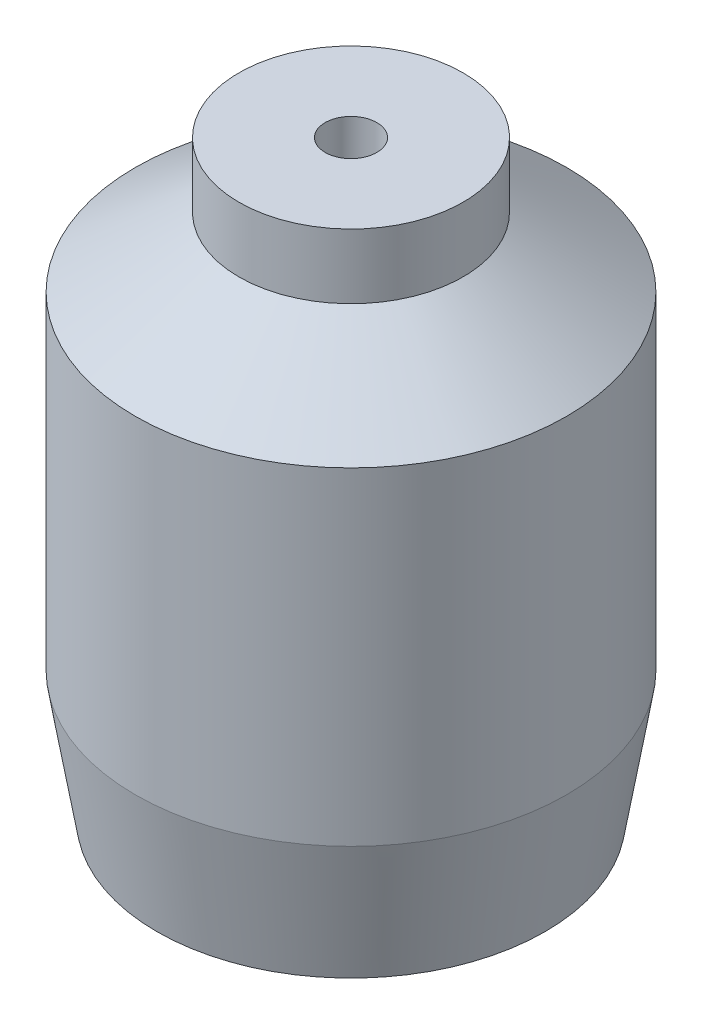
ISO-10303-21;
HEADER;
FILE_DESCRIPTION(('STEP AP214'),'2;1');
FILE_NAME('part.step','',(''),(''),'','','');
FILE_SCHEMA(('AUTOMOTIVE_DESIGN { 1 0 10303 214 1 1 1 1 }'));
ENDSEC;
DATA;
#1=APPLICATION_CONTEXT('core data for automotive mechanical design processes');
#2=APPLICATION_PROTOCOL_DEFINITION('international standard','automotive_design',2000,#1);
#3=PRODUCT_CONTEXT('',#1,'mechanical');
#4=PRODUCT('Part','Part','',(#3));
#5=PRODUCT_RELATED_PRODUCT_CATEGORY('part','',(#4));
#6=PRODUCT_DEFINITION_FORMATION('','',#4);
#7=PRODUCT_DEFINITION_CONTEXT('part definition',#1,'design');
#8=PRODUCT_DEFINITION('design','',#6,#7);
#9=PRODUCT_DEFINITION_SHAPE('','',#8);
#10=(LENGTH_UNIT() NAMED_UNIT(*) SI_UNIT(.MILLI.,.METRE.));
#11=(NAMED_UNIT(*) PLANE_ANGLE_UNIT() SI_UNIT($,.RADIAN.));
#12=(NAMED_UNIT(*) SI_UNIT($,.STERADIAN.) SOLID_ANGLE_UNIT());
#13=UNCERTAINTY_MEASURE_WITH_UNIT(LENGTH_MEASURE(1.E-05),#10,'distance_accuracy_value','');
#14=(GEOMETRIC_REPRESENTATION_CONTEXT(3) GLOBAL_UNCERTAINTY_ASSIGNED_CONTEXT((#13)) GLOBAL_UNIT_ASSIGNED_CONTEXT((#10,
#11,#12)) REPRESENTATION_CONTEXT('',''));
#15=CARTESIAN_POINT('',(0.,0.,0.));
#16=DIRECTION('',(0.,0.,1.));
#17=DIRECTION('',(1.,0.,0.));
#18=AXIS2_PLACEMENT_3D('',#15,#16,#17);
#19=CARTESIAN_POINT('',(0.,68.5,0.));
#20=DIRECTION('',(0.,1.,0.));
#21=DIRECTION('',(0.,0.,1.));
#22=AXIS2_PLACEMENT_3D('',#19,#20,#21);
#23=PLANE('',#22);
#24=CARTESIAN_POINT('',(0.,68.5,0.));
#25=DIRECTION('',(0.,1.,0.));
#26=DIRECTION('',(0.,0.,1.));
#27=AXIS2_PLACEMENT_3D('',#24,#25,#26);
#28=CIRCLE('',#27,3.);
#29=CARTESIAN_POINT('',(0.,68.5,3.));
#30=VERTEX_POINT('',#29);
#31=EDGE_CURVE('E68',#30,#30,#28,.T.);
#32=ORIENTED_EDGE('',*,*,#31,.F.);
#33=EDGE_LOOP('',(#32));
#34=FACE_BOUND('',#33,.T.);
#35=CARTESIAN_POINT('',(0.,68.5,0.));
#36=DIRECTION('',(0.,-1.,0.));
#37=DIRECTION('',(0.,0.,-1.));
#38=AXIS2_PLACEMENT_3D('',#35,#36,#37);
#39=CIRCLE('',#38,13.);
#40=CARTESIAN_POINT('',(0.,68.5,-13.));
#41=VERTEX_POINT('',#40);
#42=EDGE_CURVE('E10',#41,#41,#39,.T.);
#43=ORIENTED_EDGE('',*,*,#42,.F.);
#44=EDGE_LOOP('',(#43));
#45=FACE_BOUND('',#44,.T.);
#46=ADVANCED_FACE('F41',(#34,#45),#23,.T.);
#47=CARTESIAN_POINT('',(0.,0.,0.));
#48=DIRECTION('',(0.,-1.,0.));
#49=DIRECTION('',(0.,0.,-1.));
#50=AXIS2_PLACEMENT_3D('',#47,#48,#49);
#51=CYLINDRICAL_SURFACE('',#50,13.);
#52=ORIENTED_EDGE('',*,*,#42,.T.);
#53=EDGE_LOOP('',(#52));
#54=FACE_BOUND('',#53,.T.);
#55=CARTESIAN_POINT('',(0.,61.,0.));
#56=DIRECTION('',(0.,-1.,0.));
#57=DIRECTION('',(0.,0.,-1.));
#58=AXIS2_PLACEMENT_3D('',#55,#56,#57);
#59=CIRCLE('',#58,13.);
#60=CARTESIAN_POINT('',(0.,61.,-13.));
#61=VERTEX_POINT('',#60);
#62=EDGE_CURVE('E49',#61,#61,#59,.T.);
#63=ORIENTED_EDGE('',*,*,#62,.F.);
#64=EDGE_LOOP('',(#63));
#65=FACE_BOUND('',#64,.T.);
#66=ADVANCED_FACE('F97',(#54,#65),#51,.T.);
#67=CARTESIAN_POINT('',(0.,53.,0.));
#68=DIRECTION('',(0.,-1.,0.));
#69=DIRECTION('',(0.,0.,-1.));
#70=AXIS2_PLACEMENT_3D('',#67,#68,#69);
#71=CONICAL_SURFACE('',#70,25.,0.982793723247329);
#72=ORIENTED_EDGE('',*,*,#62,.T.);
#73=EDGE_LOOP('',(#72));
#74=FACE_BOUND('',#73,.T.);
#75=CARTESIAN_POINT('',(0.,53.,0.));
#76=DIRECTION('',(0.,-1.,0.));
#77=DIRECTION('',(0.,0.,-1.));
#78=AXIS2_PLACEMENT_3D('',#75,#76,#77);
#79=CIRCLE('',#78,25.);
#80=CARTESIAN_POINT('',(0.,53.,-25.));
#81=VERTEX_POINT('',#80);
#82=EDGE_CURVE('E54',#81,#81,#79,.T.);
#83=ORIENTED_EDGE('',*,*,#82,.F.);
#84=EDGE_LOOP('',(#83));
#85=FACE_BOUND('',#84,.T.);
#86=ADVANCED_FACE('F93',(#74,#85),#71,.T.);
#87=CARTESIAN_POINT('',(0.,0.,0.));
#88=DIRECTION('',(0.,-1.,0.));
#89=DIRECTION('',(0.,0.,-1.));
#90=AXIS2_PLACEMENT_3D('',#87,#88,#89);
#91=CYLINDRICAL_SURFACE('',#90,25.);
#92=ORIENTED_EDGE('',*,*,#82,.T.);
#93=EDGE_LOOP('',(#92));
#94=FACE_BOUND('',#93,.T.);
#95=CARTESIAN_POINT('',(0.,15.,0.));
#96=DIRECTION('',(0.,-1.,0.));
#97=DIRECTION('',(0.,0.,-1.));
#98=AXIS2_PLACEMENT_3D('',#95,#96,#97);
#99=CIRCLE('',#98,25.);
#100=CARTESIAN_POINT('',(0.,15.,-25.));
#101=VERTEX_POINT('',#100);
#102=EDGE_CURVE('E60',#101,#101,#99,.T.);
#103=ORIENTED_EDGE('',*,*,#102,.F.);
#104=EDGE_LOOP('',(#103));
#105=FACE_BOUND('',#104,.T.);
#106=ADVANCED_FACE('F87',(#94,#105),#91,.T.);
#107=CARTESIAN_POINT('',(0.,0.,0.));
#108=DIRECTION('',(0.,1.,0.));
#109=DIRECTION('',(0.,0.,1.));
#110=AXIS2_PLACEMENT_3D('',#107,#108,#109);
#111=CONICAL_SURFACE('',#110,22.5,0.165148677414627);
#112=ORIENTED_EDGE('',*,*,#102,.T.);
#113=EDGE_LOOP('',(#112));
#114=FACE_BOUND('',#113,.T.);
#115=CARTESIAN_POINT('',(0.,0.,0.));
#116=DIRECTION('',(0.,-1.,0.));
#117=DIRECTION('',(0.,0.,-1.));
#118=AXIS2_PLACEMENT_3D('',#115,#116,#117);
#119=CIRCLE('',#118,22.5);
#120=CARTESIAN_POINT('',(0.,0.,-22.5));
#121=VERTEX_POINT('',#120);
#122=EDGE_CURVE('E64',#121,#121,#119,.T.);
#123=ORIENTED_EDGE('',*,*,#122,.F.);
#124=EDGE_LOOP('',(#123));
#125=FACE_BOUND('',#124,.T.);
#126=ADVANCED_FACE('F82',(#114,#125),#111,.T.);
#127=CARTESIAN_POINT('',(22.5,0.,0.));
#128=DIRECTION('',(0.,-1.,0.));
#129=DIRECTION('',(0.,0.,-1.));
#130=AXIS2_PLACEMENT_3D('',#127,#128,#129);
#131=PLANE('',#130);
#132=CARTESIAN_POINT('',(0.,0.,0.));
#133=DIRECTION('',(0.,-1.,0.));
#134=DIRECTION('',(0.,0.,-1.));
#135=AXIS2_PLACEMENT_3D('',#132,#133,#134);
#136=CIRCLE('',#135,3.);
#137=CARTESIAN_POINT('',(0.,0.,-3.));
#138=VERTEX_POINT('',#137);
#139=EDGE_CURVE('E44',#138,#138,#136,.T.);
#140=ORIENTED_EDGE('',*,*,#139,.F.);
#141=EDGE_LOOP('',(#140));
#142=FACE_BOUND('',#141,.T.);
#143=ORIENTED_EDGE('',*,*,#122,.T.);
#144=EDGE_LOOP('',(#143));
#145=FACE_BOUND('',#144,.T.);
#146=ADVANCED_FACE('F79',(#142,#145),#131,.T.);
#147=CARTESIAN_POINT('',(0.,-1.5,0.));
#148=DIRECTION('',(0.,1.,0.));
#149=DIRECTION('',(0.,0.,1.));
#150=AXIS2_PLACEMENT_3D('',#147,#148,#149);
#151=CYLINDRICAL_SURFACE('',#150,3.);
#152=ORIENTED_EDGE('',*,*,#139,.T.);
#153=EDGE_LOOP('',(#152));
#154=FACE_BOUND('',#153,.T.);
#155=ORIENTED_EDGE('',*,*,#31,.T.);
#156=EDGE_LOOP('',(#155));
#157=FACE_BOUND('',#156,.T.);
#158=ADVANCED_FACE('F77',(#154,#157),#151,.F.);
#159=CLOSED_SHELL('',(#46,#66,#86,#106,#126,#146,#158));
#160=MANIFOLD_SOLID_BREP('B2',#159);
#161=ADVANCED_BREP_SHAPE_REPRESENTATION('',(#18,#160),#14);
#162=SHAPE_DEFINITION_REPRESENTATION(#9,#161);
ENDSEC;
END-ISO-10303-21;
